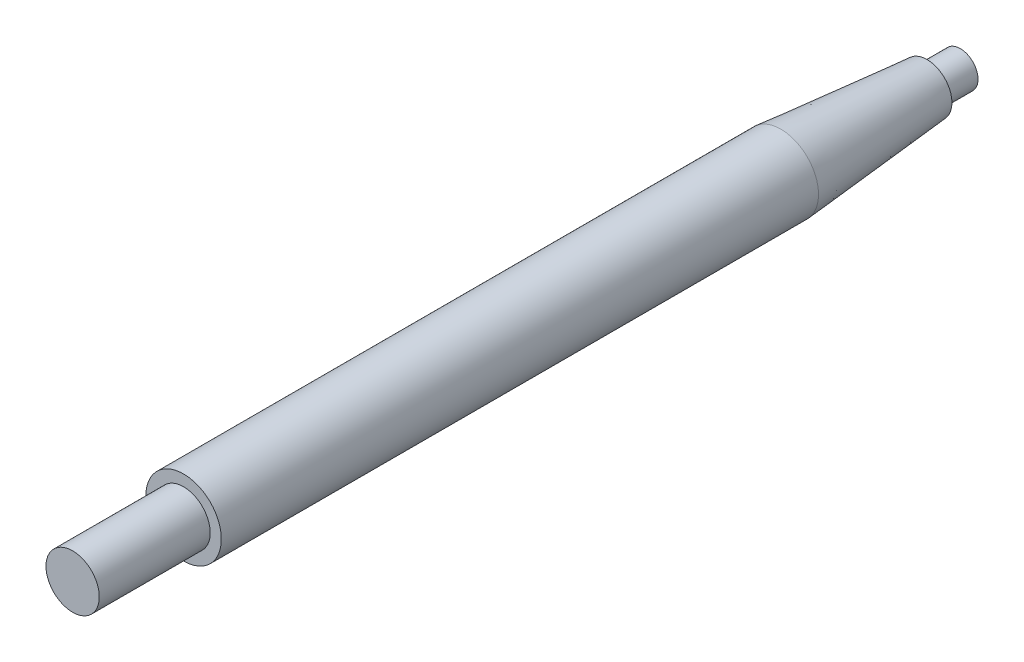
ISO-10303-21;
HEADER;
FILE_DESCRIPTION(('STEP AP214'),'2;1');
FILE_NAME('part.step','',(''),(''),'','','');
FILE_SCHEMA(('AUTOMOTIVE_DESIGN { 1 0 10303 214 1 1 1 1 }'));
ENDSEC;
DATA;
#1=APPLICATION_CONTEXT('core data for automotive mechanical design processes');
#2=APPLICATION_PROTOCOL_DEFINITION('international standard','automotive_design',2000,#1);
#3=PRODUCT_CONTEXT('',#1,'mechanical');
#4=PRODUCT('Part','Part','',(#3));
#5=PRODUCT_RELATED_PRODUCT_CATEGORY('part','',(#4));
#6=PRODUCT_DEFINITION_FORMATION('','',#4);
#7=PRODUCT_DEFINITION_CONTEXT('part definition',#1,'design');
#8=PRODUCT_DEFINITION('design','',#6,#7);
#9=PRODUCT_DEFINITION_SHAPE('','',#8);
#10=(LENGTH_UNIT() NAMED_UNIT(*) SI_UNIT(.MILLI.,.METRE.));
#11=(NAMED_UNIT(*) PLANE_ANGLE_UNIT() SI_UNIT($,.RADIAN.));
#12=(NAMED_UNIT(*) SI_UNIT($,.STERADIAN.) SOLID_ANGLE_UNIT());
#13=UNCERTAINTY_MEASURE_WITH_UNIT(LENGTH_MEASURE(1.E-05),#10,'distance_accuracy_value','');
#14=(GEOMETRIC_REPRESENTATION_CONTEXT(3) GLOBAL_UNCERTAINTY_ASSIGNED_CONTEXT((#13)) GLOBAL_UNIT_ASSIGNED_CONTEXT((#10,
#11,#12)) REPRESENTATION_CONTEXT('',''));
#15=CARTESIAN_POINT('',(0.,0.,0.));
#16=DIRECTION('',(0.,0.,1.));
#17=DIRECTION('',(1.,0.,0.));
#18=AXIS2_PLACEMENT_3D('',#15,#16,#17);
#19=CARTESIAN_POINT('',(-10.8434851061855,0.,38.5074006138957));
#20=DIRECTION('',(0.,0.,-1.));
#21=DIRECTION('',(-1.,0.,0.));
#22=AXIS2_PLACEMENT_3D('',#19,#20,#21);
#23=PLANE('',#22);
#24=CARTESIAN_POINT('',(-16.8434851061855,0.,38.5074006138957));
#25=DIRECTION('',(0.,0.,-1.));
#26=DIRECTION('',(-1.,0.,0.));
#27=AXIS2_PLACEMENT_3D('',#24,#25,#26);
#28=CIRCLE('',#27,6.);
#29=CARTESIAN_POINT('',(-22.8434851061855,0.,38.5074006138957));
#30=VERTEX_POINT('',#29);
#31=EDGE_CURVE('E10',#30,#30,#28,.T.);
#32=ORIENTED_EDGE('',*,*,#31,.F.);
#33=EDGE_LOOP('',(#32));
#34=FACE_BOUND('',#33,.T.);
#35=ADVANCED_FACE('F48',(#34),#23,.F.);
#36=CARTESIAN_POINT('',(-16.8434851061855,0.,-161.492599386104));
#37=DIRECTION('',(0.,0.,-1.));
#38=DIRECTION('',(-1.,0.,0.));
#39=AXIS2_PLACEMENT_3D('',#36,#37,#38);
#40=CYLINDRICAL_SURFACE('',#39,6.);
#41=CARTESIAN_POINT('',(-16.8434851061855,0.,13.5074006138957));
#42=DIRECTION('',(0.,0.,-1.));
#43=DIRECTION('',(-1.,0.,0.));
#44=AXIS2_PLACEMENT_3D('',#41,#42,#43);
#45=CIRCLE('',#44,5.99999999999999);
#46=CARTESIAN_POINT('',(-22.8434851061855,0.,13.5074006138957));
#47=VERTEX_POINT('',#46);
#48=EDGE_CURVE('E54',#47,#47,#45,.T.);
#49=ORIENTED_EDGE('',*,*,#48,.F.);
#50=EDGE_LOOP('',(#49));
#51=FACE_BOUND('',#50,.T.);
#52=ORIENTED_EDGE('',*,*,#31,.T.);
#53=EDGE_LOOP('',(#52));
#54=FACE_BOUND('',#53,.T.);
#55=ADVANCED_FACE('F105',(#51,#54),#40,.T.);
#56=CARTESIAN_POINT('',(-8.34348510618554,0.,13.5074006138957));
#57=DIRECTION('',(0.,0.,-1.));
#58=DIRECTION('',(-1.,0.,0.));
#59=AXIS2_PLACEMENT_3D('',#56,#57,#58);
#60=PLANE('',#59);
#61=CARTESIAN_POINT('',(-16.8434851061855,0.,13.5074006138957));
#62=DIRECTION('',(0.,0.,-1.));
#63=DIRECTION('',(-1.,0.,0.));
#64=AXIS2_PLACEMENT_3D('',#61,#62,#63);
#65=CIRCLE('',#64,8.5);
#66=CARTESIAN_POINT('',(-25.3434851061855,0.,13.5074006138957));
#67=VERTEX_POINT('',#66);
#68=EDGE_CURVE('E58',#67,#67,#65,.T.);
#69=ORIENTED_EDGE('',*,*,#68,.F.);
#70=EDGE_LOOP('',(#69));
#71=FACE_BOUND('',#70,.T.);
#72=ORIENTED_EDGE('',*,*,#48,.T.);
#73=EDGE_LOOP('',(#72));
#74=FACE_BOUND('',#73,.T.);
#75=ADVANCED_FACE('F100',(#71,#74),#60,.F.);
#76=CARTESIAN_POINT('',(-16.8434851061855,0.,-161.492599386104));
#77=DIRECTION('',(0.,0.,-1.));
#78=DIRECTION('',(-1.,0.,0.));
#79=AXIS2_PLACEMENT_3D('',#76,#77,#78);
#80=CYLINDRICAL_SURFACE('',#79,8.5);
#81=CARTESIAN_POINT('',(-16.8434851061855,0.,-121.052599386104));
#82=DIRECTION('',(0.,0.,-1.));
#83=DIRECTION('',(-1.,0.,0.));
#84=AXIS2_PLACEMENT_3D('',#81,#82,#83);
#85=CIRCLE('',#84,8.5);
#86=CARTESIAN_POINT('',(-25.3434851061856,0.,-121.052599386104));
#87=VERTEX_POINT('',#86);
#88=EDGE_CURVE('E62',#87,#87,#85,.T.);
#89=ORIENTED_EDGE('',*,*,#88,.F.);
#90=EDGE_LOOP('',(#89));
#91=FACE_BOUND('',#90,.T.);
#92=ORIENTED_EDGE('',*,*,#68,.T.);
#93=EDGE_LOOP('',(#92));
#94=FACE_BOUND('',#93,.T.);
#95=ADVANCED_FACE('F94',(#91,#94),#80,.T.);
#96=CARTESIAN_POINT('',(-16.8434851061855,0.,-121.052599386104));
#97=DIRECTION('',(0.,0.,1.));
#98=DIRECTION('',(1.,0.,0.));
#99=AXIS2_PLACEMENT_3D('',#96,#97,#98);
#100=CONICAL_SURFACE('',#99,8.5,0.0872664625997167);
#101=CARTESIAN_POINT('',(-16.8434851061855,0.,-153.992599386104));
#102=DIRECTION('',(0.,0.,-1.));
#103=DIRECTION('',(-1.,0.,0.));
#104=AXIS2_PLACEMENT_3D('',#101,#102,#103);
#105=CIRCLE('',#104,5.61812342345606);
#106=CARTESIAN_POINT('',(-22.4616085296416,0.,-153.992599386104));
#107=VERTEX_POINT('',#106);
#108=EDGE_CURVE('E67',#107,#107,#105,.T.);
#109=ORIENTED_EDGE('',*,*,#108,.F.);
#110=EDGE_LOOP('',(#109));
#111=FACE_BOUND('',#110,.T.);
#112=ORIENTED_EDGE('',*,*,#88,.T.);
#113=EDGE_LOOP('',(#112));
#114=FACE_BOUND('',#113,.T.);
#115=ADVANCED_FACE('F88',(#111,#114),#100,.T.);
#116=CARTESIAN_POINT('',(-11.2253616827295,0.,-153.992599386104));
#117=DIRECTION('',(0.,0.,1.));
#118=DIRECTION('',(1.,0.,0.));
#119=AXIS2_PLACEMENT_3D('',#116,#117,#118);
#120=PLANE('',#119);
#121=CARTESIAN_POINT('',(-16.8434851061855,0.,-153.992599386104));
#122=DIRECTION('',(0.,0.,-1.));
#123=DIRECTION('',(-1.,0.,0.));
#124=AXIS2_PLACEMENT_3D('',#121,#122,#123);
#125=CIRCLE('',#124,4.);
#126=CARTESIAN_POINT('',(-20.8434851061856,0.,-153.992599386104));
#127=VERTEX_POINT('',#126);
#128=EDGE_CURVE('E70',#127,#127,#125,.T.);
#129=ORIENTED_EDGE('',*,*,#128,.F.);
#130=EDGE_LOOP('',(#129));
#131=FACE_BOUND('',#130,.T.);
#132=ORIENTED_EDGE('',*,*,#108,.T.);
#133=EDGE_LOOP('',(#132));
#134=FACE_BOUND('',#133,.T.);
#135=ADVANCED_FACE('F82',(#131,#134),#120,.F.);
#136=CARTESIAN_POINT('',(-16.8434851061855,0.,-161.492599386104));
#137=DIRECTION('',(0.,0.,-1.));
#138=DIRECTION('',(-1.,0.,0.));
#139=AXIS2_PLACEMENT_3D('',#136,#137,#138);
#140=CYLINDRICAL_SURFACE('',#139,4.);
#141=CARTESIAN_POINT('',(-16.8434851061855,0.,-161.492599386104));
#142=DIRECTION('',(0.,0.,-1.));
#143=DIRECTION('',(-1.,0.,0.));
#144=AXIS2_PLACEMENT_3D('',#141,#142,#143);
#145=CIRCLE('',#144,4.);
#146=CARTESIAN_POINT('',(-20.8434851061856,0.,-161.492599386104));
#147=VERTEX_POINT('',#146);
#148=EDGE_CURVE('E73',#147,#147,#145,.T.);
#149=ORIENTED_EDGE('',*,*,#148,.F.);
#150=EDGE_LOOP('',(#149));
#151=FACE_BOUND('',#150,.T.);
#152=ORIENTED_EDGE('',*,*,#128,.T.);
#153=EDGE_LOOP('',(#152));
#154=FACE_BOUND('',#153,.T.);
#155=ADVANCED_FACE('F79',(#151,#154),#140,.T.);
#156=CARTESIAN_POINT('',(-12.8434851061855,0.,-161.492599386104));
#157=DIRECTION('',(0.,0.,1.));
#158=DIRECTION('',(1.,0.,0.));
#159=AXIS2_PLACEMENT_3D('',#156,#157,#158);
#160=PLANE('',#159);
#161=ORIENTED_EDGE('',*,*,#148,.T.);
#162=EDGE_LOOP('',(#161));
#163=FACE_BOUND('',#162,.T.);
#164=ADVANCED_FACE('F77',(#163),#160,.F.);
#165=CLOSED_SHELL('',(#35,#55,#75,#95,#115,#135,#155,#164));
#166=MANIFOLD_SOLID_BREP('B2',#165);
#167=ADVANCED_BREP_SHAPE_REPRESENTATION('',(#18,#166),#14);
#168=SHAPE_DEFINITION_REPRESENTATION(#9,#167);
ENDSEC;
END-ISO-10303-21;
